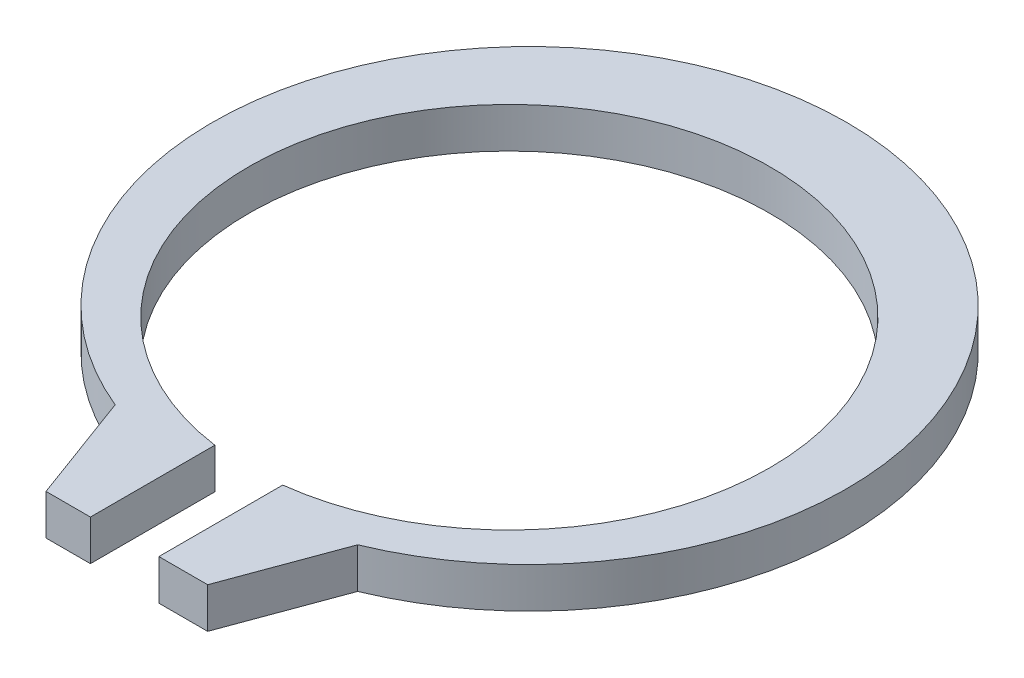
ISO-10303-21;
HEADER;
FILE_DESCRIPTION(('STEP AP214'),'2;1');
FILE_NAME('part.step','',(''),(''),'','','');
FILE_SCHEMA(('AUTOMOTIVE_DESIGN { 1 0 10303 214 1 1 1 1 }'));
ENDSEC;
DATA;
#1=APPLICATION_CONTEXT('core data for automotive mechanical design processes');
#2=APPLICATION_PROTOCOL_DEFINITION('international standard','automotive_design',2000,#1);
#3=PRODUCT_CONTEXT('',#1,'mechanical');
#4=PRODUCT('Part','Part','',(#3));
#5=PRODUCT_RELATED_PRODUCT_CATEGORY('part','',(#4));
#6=PRODUCT_DEFINITION_FORMATION('','',#4);
#7=PRODUCT_DEFINITION_CONTEXT('part definition',#1,'design');
#8=PRODUCT_DEFINITION('design','',#6,#7);
#9=PRODUCT_DEFINITION_SHAPE('','',#8);
#10=(LENGTH_UNIT() NAMED_UNIT(*) SI_UNIT(.MILLI.,.METRE.));
#11=(NAMED_UNIT(*) PLANE_ANGLE_UNIT() SI_UNIT($,.RADIAN.));
#12=(NAMED_UNIT(*) SI_UNIT($,.STERADIAN.) SOLID_ANGLE_UNIT());
#13=UNCERTAINTY_MEASURE_WITH_UNIT(LENGTH_MEASURE(1.E-05),#10,'distance_accuracy_value','');
#14=(GEOMETRIC_REPRESENTATION_CONTEXT(3) GLOBAL_UNCERTAINTY_ASSIGNED_CONTEXT((#13)) GLOBAL_UNIT_ASSIGNED_CONTEXT((#10,
#11,#12)) REPRESENTATION_CONTEXT('',''));
#15=CARTESIAN_POINT('',(0.,0.,0.));
#16=DIRECTION('',(0.,0.,1.));
#17=DIRECTION('',(1.,0.,0.));
#18=AXIS2_PLACEMENT_3D('',#15,#16,#17);
#19=CARTESIAN_POINT('',(0.,1.,9.46530997901408));
#20=DIRECTION('',(0.,0.,-1.));
#21=DIRECTION('',(-1.,0.,0.));
#22=AXIS2_PLACEMENT_3D('',#19,#20,#21);
#23=PLANE('',#22);
#24=DIRECTION('',(1.,0.,0.));
#25=VECTOR('',#24,1.);
#26=CARTESIAN_POINT('',(0.,0.,9.46530997901408));
#27=LINE('',#26,#25);
#28=CARTESIAN_POINT('',(-2.,0.,9.46530997901408));
#29=VERTEX_POINT('',#28);
#30=CARTESIAN_POINT('',(-0.90094595040472,0.,9.46530997901408));
#31=VERTEX_POINT('',#30);
#32=EDGE_CURVE('E117',#29,#31,#27,.T.);
#33=ORIENTED_EDGE('',*,*,#32,.T.);
#34=DIRECTION('',(0.,1.,0.));
#35=VECTOR('',#34,1.);
#36=CARTESIAN_POINT('',(-0.90094595040472,1.,9.46530997901408));
#37=LINE('',#36,#35);
#38=CARTESIAN_POINT('',(-0.90094595040472,1.,9.46530997901408));
#39=VERTEX_POINT('',#38);
#40=EDGE_CURVE('E119',#31,#39,#37,.T.);
#41=ORIENTED_EDGE('',*,*,#40,.T.);
#42=DIRECTION('',(1.,0.,0.));
#43=VECTOR('',#42,1.);
#44=CARTESIAN_POINT('',(0.,1.,9.46530997901408));
#45=LINE('',#44,#43);
#46=CARTESIAN_POINT('',(-2.,1.,9.46530997901408));
#47=VERTEX_POINT('',#46);
#48=EDGE_CURVE('E111',#47,#39,#45,.T.);
#49=ORIENTED_EDGE('',*,*,#48,.F.);
#50=DIRECTION('',(0.,-1.,0.));
#51=VECTOR('',#50,1.);
#52=CARTESIAN_POINT('',(-2.,1.,9.46530997901408));
#53=LINE('',#52,#51);
#54=EDGE_CURVE('E131',#47,#29,#53,.T.);
#55=ORIENTED_EDGE('',*,*,#54,.T.);
#56=EDGE_LOOP('',(#33,#41,#49,#55));
#57=FACE_BOUND('',#56,.T.);
#58=ADVANCED_FACE('F36',(#57),#23,.F.);
#59=CARTESIAN_POINT('',(0.,1.,-0.5));
#60=DIRECTION('',(0.,1.,0.));
#61=DIRECTION('',(0.,0.,1.));
#62=AXIS2_PLACEMENT_3D('',#59,#60,#61);
#63=PLANE('',#62);
#64=DIRECTION('',(0.,0.,1.));
#65=VECTOR('',#64,1.);
#66=CARTESIAN_POINT('',(-0.90094595040472,1.,5.51177325208553));
#67=LINE('',#66,#65);
#68=CARTESIAN_POINT('',(-0.90094595040472,1.,6.3867672882648));
#69=VERTEX_POINT('',#68);
#70=EDGE_CURVE('E99',#69,#39,#67,.T.);
#71=ORIENTED_EDGE('',*,*,#70,.F.);
#72=CARTESIAN_POINT('',(0.,1.,0.));
#73=DIRECTION('',(0.,1.,0.));
#74=DIRECTION('',(0.,0.,1.));
#75=AXIS2_PLACEMENT_3D('',#72,#73,#74);
#76=CIRCLE('',#75,6.45);
#77=CARTESIAN_POINT('',(0.793016721915743,1.,6.40106432390442));
#78=VERTEX_POINT('',#77);
#79=EDGE_CURVE('E109',#78,#69,#76,.T.);
#80=ORIENTED_EDGE('',*,*,#79,.F.);
#81=DIRECTION('',(0.,0.,-1.));
#82=VECTOR('',#81,1.);
#83=CARTESIAN_POINT('',(0.793016721915743,1.,5.51177325208553));
#84=LINE('',#83,#82);
#85=CARTESIAN_POINT('',(0.793016721915743,1.,9.46530997901408));
#86=VERTEX_POINT('',#85);
#87=EDGE_CURVE('E58',#86,#78,#84,.T.);
#88=ORIENTED_EDGE('',*,*,#87,.F.);
#89=CARTESIAN_POINT('',(2.,1.,9.46530997901408));
#90=VERTEX_POINT('',#89);
#91=EDGE_CURVE('E126',#86,#90,#45,.T.);
#92=ORIENTED_EDGE('',*,*,#91,.T.);
#93=DIRECTION('',(0.346054732528229,0.,-0.938214326310793));
#94=VECTOR('',#93,1.);
#95=CARTESIAN_POINT('',(2.,1.,9.46530997901408));
#96=LINE('',#95,#94);
#97=CARTESIAN_POINT('',(3.,1.,6.75413675084775));
#98=VERTEX_POINT('',#97);
#99=EDGE_CURVE('E125',#90,#98,#96,.T.);
#100=ORIENTED_EDGE('',*,*,#99,.T.);
#101=CARTESIAN_POINT('',(0.,1.,-0.5));
#102=DIRECTION('',(0.,1.,0.));
#103=DIRECTION('',(0.,0.,1.));
#104=AXIS2_PLACEMENT_3D('',#101,#102,#103);
#105=CIRCLE('',#104,7.85);
#106=CARTESIAN_POINT('',(-3.,1.,6.75413675084775));
#107=VERTEX_POINT('',#106);
#108=EDGE_CURVE('E128',#98,#107,#105,.T.);
#109=ORIENTED_EDGE('',*,*,#108,.T.);
#110=DIRECTION('',(0.346054732528229,0.,0.938214326310793));
#111=VECTOR('',#110,1.);
#112=CARTESIAN_POINT('',(-2.,1.,9.46530997901408));
#113=LINE('',#112,#111);
#114=EDGE_CURVE('E130',#107,#47,#113,.T.);
#115=ORIENTED_EDGE('',*,*,#114,.T.);
#116=ORIENTED_EDGE('',*,*,#48,.T.);
#117=EDGE_LOOP('',(#71,#80,#88,#92,#100,#109,#115,#116));
#118=FACE_BOUND('',#117,.T.);
#119=ADVANCED_FACE('F108',(#118),#63,.T.);
#120=CARTESIAN_POINT('',(0.,0.,-0.5));
#121=DIRECTION('',(0.,1.,0.));
#122=DIRECTION('',(0.,0.,1.));
#123=AXIS2_PLACEMENT_3D('',#120,#121,#122);
#124=PLANE('',#123);
#125=CARTESIAN_POINT('',(0.,0.,0.));
#126=DIRECTION('',(0.,1.,0.));
#127=DIRECTION('',(0.,0.,1.));
#128=AXIS2_PLACEMENT_3D('',#125,#126,#127);
#129=CIRCLE('',#128,6.45);
#130=CARTESIAN_POINT('',(0.793016721915743,0.,6.40106432390442));
#131=VERTEX_POINT('',#130);
#132=CARTESIAN_POINT('',(-0.90094595040472,0.,6.3867672882648));
#133=VERTEX_POINT('',#132);
#134=EDGE_CURVE('E115',#131,#133,#129,.T.);
#135=ORIENTED_EDGE('',*,*,#134,.T.);
#136=DIRECTION('',(0.,0.,1.));
#137=VECTOR('',#136,1.);
#138=CARTESIAN_POINT('',(-0.90094595040472,0.,-0.5));
#139=LINE('',#138,#137);
#140=EDGE_CURVE('E50',#133,#31,#139,.T.);
#141=ORIENTED_EDGE('',*,*,#140,.T.);
#142=ORIENTED_EDGE('',*,*,#32,.F.);
#143=DIRECTION('',(0.346054732528229,0.,0.938214326310793));
#144=VECTOR('',#143,1.);
#145=CARTESIAN_POINT('',(-2.,0.,9.46530997901408));
#146=LINE('',#145,#144);
#147=CARTESIAN_POINT('',(-3.,0.,6.75413675084775));
#148=VERTEX_POINT('',#147);
#149=EDGE_CURVE('E138',#148,#29,#146,.T.);
#150=ORIENTED_EDGE('',*,*,#149,.F.);
#151=CARTESIAN_POINT('',(0.,0.,-0.5));
#152=DIRECTION('',(0.,1.,0.));
#153=DIRECTION('',(0.,0.,1.));
#154=AXIS2_PLACEMENT_3D('',#151,#152,#153);
#155=CIRCLE('',#154,7.85);
#156=CARTESIAN_POINT('',(3.,0.,6.75413675084775));
#157=VERTEX_POINT('',#156);
#158=EDGE_CURVE('E136',#157,#148,#155,.T.);
#159=ORIENTED_EDGE('',*,*,#158,.F.);
#160=DIRECTION('',(0.346054732528229,0.,-0.938214326310793));
#161=VECTOR('',#160,1.);
#162=CARTESIAN_POINT('',(2.,0.,9.46530997901408));
#163=LINE('',#162,#161);
#164=CARTESIAN_POINT('',(2.,0.,9.46530997901408));
#165=VERTEX_POINT('',#164);
#166=EDGE_CURVE('E134',#165,#157,#163,.T.);
#167=ORIENTED_EDGE('',*,*,#166,.F.);
#168=CARTESIAN_POINT('',(0.793016721915743,0.,9.46530997901408));
#169=VERTEX_POINT('',#168);
#170=EDGE_CURVE('E114',#169,#165,#27,.T.);
#171=ORIENTED_EDGE('',*,*,#170,.F.);
#172=DIRECTION('',(0.,0.,-1.));
#173=VECTOR('',#172,1.);
#174=CARTESIAN_POINT('',(0.793016721915743,0.,-0.5));
#175=LINE('',#174,#173);
#176=EDGE_CURVE('E153',#169,#131,#175,.T.);
#177=ORIENTED_EDGE('',*,*,#176,.T.);
#178=EDGE_LOOP('',(#135,#141,#142,#150,#159,#167,#171,#177));
#179=FACE_BOUND('',#178,.T.);
#180=ADVANCED_FACE('F157',(#179),#124,.F.);
#181=ORIENTED_EDGE('',*,*,#91,.F.);
#182=DIRECTION('',(0.,-1.,0.));
#183=VECTOR('',#182,1.);
#184=CARTESIAN_POINT('',(0.793016721915743,1.,9.46530997901408));
#185=LINE('',#184,#183);
#186=EDGE_CURVE('E159',#86,#169,#185,.T.);
#187=ORIENTED_EDGE('',*,*,#186,.T.);
#188=ORIENTED_EDGE('',*,*,#170,.T.);
#189=DIRECTION('',(0.,-1.,0.));
#190=VECTOR('',#189,1.);
#191=CARTESIAN_POINT('',(2.,1.,9.46530997901408));
#192=LINE('',#191,#190);
#193=EDGE_CURVE('E149',#90,#165,#192,.T.);
#194=ORIENTED_EDGE('',*,*,#193,.F.);
#195=EDGE_LOOP('',(#181,#187,#188,#194));
#196=FACE_BOUND('',#195,.T.);
#197=ADVANCED_FACE('F38',(#196),#23,.F.);
#198=CARTESIAN_POINT('',(2.,1.,9.46530997901408));
#199=DIRECTION('',(-0.938214326310793,0.,-0.346054732528229));
#200=DIRECTION('',(-0.346054732528229,0.,0.938214326310793));
#201=AXIS2_PLACEMENT_3D('',#198,#199,#200);
#202=PLANE('',#201);
#203=ORIENTED_EDGE('',*,*,#166,.T.);
#204=DIRECTION('',(0.,-1.,0.));
#205=VECTOR('',#204,1.);
#206=CARTESIAN_POINT('',(3.,1.,6.75413675084775));
#207=LINE('',#206,#205);
#208=EDGE_CURVE('E146',#98,#157,#207,.T.);
#209=ORIENTED_EDGE('',*,*,#208,.F.);
#210=ORIENTED_EDGE('',*,*,#99,.F.);
#211=ORIENTED_EDGE('',*,*,#193,.T.);
#212=EDGE_LOOP('',(#203,#209,#210,#211));
#213=FACE_BOUND('',#212,.T.);
#214=ADVANCED_FACE('F176',(#213),#202,.F.);
#215=CARTESIAN_POINT('',(0.,1.,-0.5));
#216=DIRECTION('',(0.,-1.,0.));
#217=DIRECTION('',(0.,0.,-1.));
#218=AXIS2_PLACEMENT_3D('',#215,#216,#217);
#219=CYLINDRICAL_SURFACE('',#218,7.85);
#220=ORIENTED_EDGE('',*,*,#158,.T.);
#221=DIRECTION('',(0.,-1.,0.));
#222=VECTOR('',#221,1.);
#223=CARTESIAN_POINT('',(-3.,1.,6.75413675084775));
#224=LINE('',#223,#222);
#225=EDGE_CURVE('E143',#107,#148,#224,.T.);
#226=ORIENTED_EDGE('',*,*,#225,.F.);
#227=ORIENTED_EDGE('',*,*,#108,.F.);
#228=ORIENTED_EDGE('',*,*,#208,.T.);
#229=EDGE_LOOP('',(#220,#226,#227,#228));
#230=FACE_BOUND('',#229,.T.);
#231=ADVANCED_FACE('F173',(#230),#219,.T.);
#232=CARTESIAN_POINT('',(-2.,1.,9.46530997901408));
#233=DIRECTION('',(0.938214326310793,0.,-0.346054732528229));
#234=DIRECTION('',(-0.346054732528229,0.,-0.938214326310793));
#235=AXIS2_PLACEMENT_3D('',#232,#233,#234);
#236=PLANE('',#235);
#237=ORIENTED_EDGE('',*,*,#149,.T.);
#238=ORIENTED_EDGE('',*,*,#54,.F.);
#239=ORIENTED_EDGE('',*,*,#114,.F.);
#240=ORIENTED_EDGE('',*,*,#225,.T.);
#241=EDGE_LOOP('',(#237,#238,#239,#240));
#242=FACE_BOUND('',#241,.T.);
#243=ADVANCED_FACE('F168',(#242),#236,.F.);
#244=CARTESIAN_POINT('',(0.,1.,0.));
#245=DIRECTION('',(0.,-1.,0.));
#246=DIRECTION('',(0.,0.,-1.));
#247=AXIS2_PLACEMENT_3D('',#244,#245,#246);
#248=CYLINDRICAL_SURFACE('',#247,6.45);
#249=DIRECTION('',(0.,-1.,0.));
#250=VECTOR('',#249,1.);
#251=CARTESIAN_POINT('',(-0.90094595040472,1.,6.3867672882648));
#252=LINE('',#251,#250);
#253=EDGE_CURVE('E11',#133,#69,#252,.F.);
#254=ORIENTED_EDGE('',*,*,#253,.F.);
#255=ORIENTED_EDGE('',*,*,#134,.F.);
#256=DIRECTION('',(0.,-1.,0.));
#257=VECTOR('',#256,1.);
#258=CARTESIAN_POINT('',(0.793016721915743,1.,6.40106432390442));
#259=LINE('',#258,#257);
#260=EDGE_CURVE('E44',#78,#131,#259,.T.);
#261=ORIENTED_EDGE('',*,*,#260,.F.);
#262=ORIENTED_EDGE('',*,*,#79,.T.);
#263=EDGE_LOOP('',(#254,#255,#261,#262));
#264=FACE_BOUND('',#263,.T.);
#265=ADVANCED_FACE('F113',(#264),#248,.F.);
#266=CARTESIAN_POINT('',(0.793016721915743,-9.,5.51177325208553));
#267=DIRECTION('',(1.,0.,0.));
#268=DIRECTION('',(0.,0.,-1.));
#269=AXIS2_PLACEMENT_3D('',#266,#267,#268);
#270=PLANE('',#269);
#271=ORIENTED_EDGE('',*,*,#87,.T.);
#272=ORIENTED_EDGE('',*,*,#260,.T.);
#273=ORIENTED_EDGE('',*,*,#176,.F.);
#274=ORIENTED_EDGE('',*,*,#186,.F.);
#275=EDGE_LOOP('',(#271,#272,#273,#274));
#276=FACE_BOUND('',#275,.T.);
#277=ADVANCED_FACE('F152',(#276),#270,.F.);
#278=CARTESIAN_POINT('',(-0.90094595040472,-9.,5.51177325208553));
#279=DIRECTION('',(-1.,0.,0.));
#280=DIRECTION('',(0.,0.,1.));
#281=AXIS2_PLACEMENT_3D('',#278,#279,#280);
#282=PLANE('',#281);
#283=ORIENTED_EDGE('',*,*,#140,.F.);
#284=ORIENTED_EDGE('',*,*,#253,.T.);
#285=ORIENTED_EDGE('',*,*,#70,.T.);
#286=ORIENTED_EDGE('',*,*,#40,.F.);
#287=EDGE_LOOP('',(#283,#284,#285,#286));
#288=FACE_BOUND('',#287,.T.);
#289=ADVANCED_FACE('F98',(#288),#282,.F.);
#290=CLOSED_SHELL('',(#58,#119,#180,#197,#214,#231,#243,#265,#277,#289));
#291=MANIFOLD_SOLID_BREP('B2',#290);
#292=ADVANCED_BREP_SHAPE_REPRESENTATION('',(#18,#291),#14);
#293=SHAPE_DEFINITION_REPRESENTATION(#9,#292);
ENDSEC;
END-ISO-10303-21;
